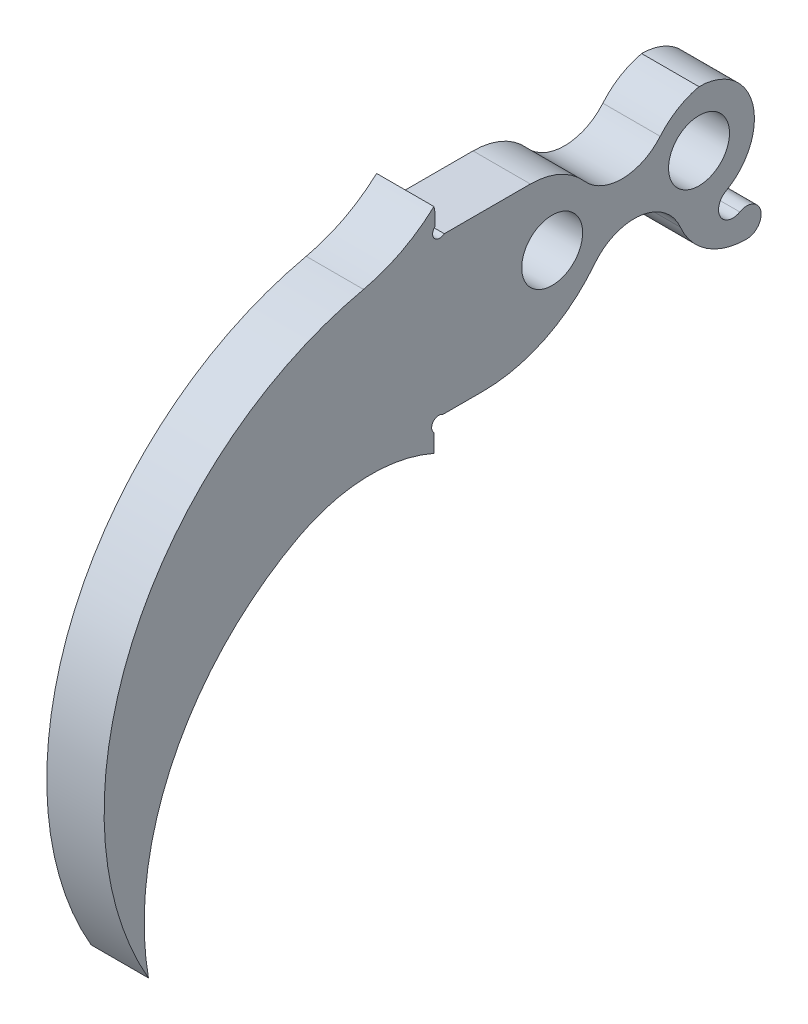
ISO-10303-21;
HEADER;
FILE_DESCRIPTION(('STEP AP214'),'2;1');
FILE_NAME('part.step','',(''),(''),'','','');
FILE_SCHEMA(('AUTOMOTIVE_DESIGN { 1 0 10303 214 1 1 1 1 }'));
ENDSEC;
DATA;
#1=APPLICATION_CONTEXT('core data for automotive mechanical design processes');
#2=APPLICATION_PROTOCOL_DEFINITION('international standard','automotive_design',2000,#1);
#3=PRODUCT_CONTEXT('',#1,'mechanical');
#4=PRODUCT('Part','Part','',(#3));
#5=PRODUCT_RELATED_PRODUCT_CATEGORY('part','',(#4));
#6=PRODUCT_DEFINITION_FORMATION('','',#4);
#7=PRODUCT_DEFINITION_CONTEXT('part definition',#1,'design');
#8=PRODUCT_DEFINITION('design','',#6,#7);
#9=PRODUCT_DEFINITION_SHAPE('','',#8);
#10=(LENGTH_UNIT() NAMED_UNIT(*) SI_UNIT(.MILLI.,.METRE.));
#11=(NAMED_UNIT(*) PLANE_ANGLE_UNIT() SI_UNIT($,.RADIAN.));
#12=(NAMED_UNIT(*) SI_UNIT($,.STERADIAN.) SOLID_ANGLE_UNIT());
#13=UNCERTAINTY_MEASURE_WITH_UNIT(LENGTH_MEASURE(1.E-05),#10,'distance_accuracy_value','');
#14=(GEOMETRIC_REPRESENTATION_CONTEXT(3) GLOBAL_UNCERTAINTY_ASSIGNED_CONTEXT((#13)) GLOBAL_UNIT_ASSIGNED_CONTEXT((#10,
#11,#12)) REPRESENTATION_CONTEXT('',''));
#15=CARTESIAN_POINT('',(0.,0.,0.));
#16=DIRECTION('',(0.,0.,1.));
#17=DIRECTION('',(1.,0.,0.));
#18=AXIS2_PLACEMENT_3D('',#15,#16,#17);
#19=CARTESIAN_POINT('',(-270.7,0.,0.));
#20=DIRECTION('',(1.,0.,0.));
#21=DIRECTION('',(0.,0.,-1.));
#22=AXIS2_PLACEMENT_3D('',#19,#20,#21);
#23=PLANE('',#22);
#24=CARTESIAN_POINT('',(-270.7,188.104455092555,538.616481200262));
#25=DIRECTION('',(1.,0.,0.));
#26=DIRECTION('',(0.,0.,-1.));
#27=AXIS2_PLACEMENT_3D('',#24,#25,#26);
#28=CIRCLE('',#27,4.24999999999999);
#29=CARTESIAN_POINT('',(-270.7,188.104455092555,534.366481200262));
#30=VERTEX_POINT('',#29);
#31=EDGE_CURVE('E344',#30,#30,#28,.F.);
#32=ORIENTED_EDGE('',*,*,#31,.T.);
#33=EDGE_LOOP('',(#32));
#34=FACE_BOUND('',#33,.T.);
#35=DIRECTION('',(0.,0.,-1.));
#36=VECTOR('',#35,1.);
#37=CARTESIAN_POINT('',(-270.7,195.836750891268,575.412895232632));
#38=LINE('',#37,#36);
#39=CARTESIAN_POINT('',(-270.7,195.836750891268,574.145756948853));
#40=VERTEX_POINT('',#39);
#41=CARTESIAN_POINT('',(-270.7,195.836750891268,562.137088492214));
#42=VERTEX_POINT('',#41);
#43=EDGE_CURVE('E193',#40,#42,#38,.T.);
#44=ORIENTED_EDGE('',*,*,#43,.F.);
#45=CARTESIAN_POINT('',(-270.7,196.610436966137,574.779326090742));
#46=DIRECTION('',(1.,0.,0.));
#47=DIRECTION('',(0.,0.,-1.));
#48=AXIS2_PLACEMENT_3D('',#45,#46,#47);
#49=CIRCLE('',#48,1.00000000000005);
#50=CARTESIAN_POINT('',(-270.7,197.384123041006,575.412895232632));
#51=VERTEX_POINT('',#50);
#52=EDGE_CURVE('E200',#40,#51,#49,.F.);
#53=ORIENTED_EDGE('',*,*,#52,.T.);
#54=DIRECTION('',(0.,-1.,0.));
#55=VECTOR('',#54,1.);
#56=CARTESIAN_POINT('',(-270.7,195.836750891268,575.412895232632));
#57=LINE('',#56,#55);
#58=CARTESIAN_POINT('',(-270.7,198.84824590337,575.412895232632));
#59=VERTEX_POINT('',#58);
#60=EDGE_CURVE('E335',#59,#51,#57,.T.);
#61=ORIENTED_EDGE('',*,*,#60,.F.);
#62=DIRECTION('',(0.,-0.984807753012209,-0.173648177666923));
#63=VECTOR('',#62,1.);
#64=CARTESIAN_POINT('',(-270.7,196.026039352418,574.915264072567));
#65=LINE('',#64,#63);
#66=CARTESIAN_POINT('',(-270.7,199.839030724963,575.587597328755));
#67=VERTEX_POINT('',#66);
#68=EDGE_CURVE('E192',#67,#59,#65,.T.);
#69=ORIENTED_EDGE('',*,*,#68,.F.);
#70=CARTESIAN_POINT('',(-270.7,215.729406191826,590.067367807445));
#71=DIRECTION('',(1.,0.,0.));
#72=DIRECTION('',(0.,0.,-1.));
#73=AXIS2_PLACEMENT_3D('',#70,#71,#72);
#74=CIRCLE('',#73,21.4980879520342);
#75=CARTESIAN_POINT('',(-270.7,194.741226884327,585.412895232632));
#76=VERTEX_POINT('',#75);
#77=EDGE_CURVE('E331',#76,#67,#74,.T.);
#78=ORIENTED_EDGE('',*,*,#77,.F.);
#79=CARTESIAN_POINT('',(-270.7,149.648729356098,575.412895232632));
#80=DIRECTION('',(1.,0.,0.));
#81=DIRECTION('',(0.,0.,-1.));
#82=AXIS2_PLACEMENT_3D('',#79,#80,#81);
#83=CIRCLE('',#82,46.18802153517);
#84=CARTESIAN_POINT('',(-270.7,126.554718588514,615.412895232632));
#85=VERTEX_POINT('',#84);
#86=EDGE_CURVE('E329',#85,#76,#83,.F.);
#87=ORIENTED_EDGE('',*,*,#86,.F.);
#88=CARTESIAN_POINT('',(-270.7,133.501294199042,575.412895232632));
#89=DIRECTION('',(1.,0.,0.));
#90=DIRECTION('',(0.,0.,-1.));
#91=AXIS2_PLACEMENT_3D('',#88,#89,#90);
#92=CIRCLE('',#91,40.5987058009585);
#93=CARTESIAN_POINT('',(-270.7,169.384333510383,594.404009009699));
#94=VERTEX_POINT('',#93);
#95=EDGE_CURVE('E327',#94,#85,#92,.T.);
#96=ORIENTED_EDGE('',*,*,#95,.F.);
#97=CARTESIAN_POINT('',(-270.7,150.383315623667,584.347712232947));
#98=DIRECTION('',(1.,0.,0.));
#99=DIRECTION('',(0.,0.,-1.));
#100=AXIS2_PLACEMENT_3D('',#97,#98,#99);
#101=CIRCLE('',#100,21.4980879520342);
#102=CARTESIAN_POINT('',(-270.7,170.026908919304,575.612895232632));
#103=VERTEX_POINT('',#102);
#104=EDGE_CURVE('E338',#103,#94,#101,.T.);
#105=ORIENTED_EDGE('',*,*,#104,.F.);
#106=DIRECTION('',(0.,-1.,0.));
#107=VECTOR('',#106,1.);
#108=CARTESIAN_POINT('',(-270.7,-103.5,575.612895232632));
#109=LINE('',#108,#107);
#110=CARTESIAN_POINT('',(-270.7,172.58052008395,575.612895232632));
#111=VERTEX_POINT('',#110);
#112=EDGE_CURVE('E199',#111,#103,#109,.T.);
#113=ORIENTED_EDGE('',*,*,#112,.F.);
#114=CARTESIAN_POINT('',(-270.7,173.290260041975,574.908431470624));
#115=DIRECTION('',(1.,0.,0.));
#116=DIRECTION('',(0.,0.,-1.));
#117=AXIS2_PLACEMENT_3D('',#114,#115,#116);
#118=CIRCLE('',#117,1.00000000000005);
#119=CARTESIAN_POINT('',(-270.7,174.1,574.321642581518));
#120=VERTEX_POINT('',#119);
#121=EDGE_CURVE('E180',#111,#120,#118,.F.);
#122=ORIENTED_EDGE('',*,*,#121,.T.);
#123=DIRECTION('',(0.,0.,1.));
#124=VECTOR('',#123,1.);
#125=CARTESIAN_POINT('',(-270.7,174.1,575.412895232632));
#126=LINE('',#125,#124);
#127=CARTESIAN_POINT('',(-270.7,174.1,568.733735067493));
#128=VERTEX_POINT('',#127);
#129=EDGE_CURVE('E186',#128,#120,#126,.T.);
#130=ORIENTED_EDGE('',*,*,#129,.F.);
#131=CARTESIAN_POINT('',(-270.7,193.802457690172,568.733735067493));
#132=DIRECTION('',(1.,0.,0.));
#133=DIRECTION('',(0.,0.,-1.));
#134=AXIS2_PLACEMENT_3D('',#131,#132,#133);
#135=CIRCLE('',#134,19.7024576901719);
#136=CARTESIAN_POINT('',(-270.7,181.708670636384,553.179727425389));
#137=VERTEX_POINT('',#136);
#138=EDGE_CURVE('E203',#128,#137,#135,.T.);
#139=ORIENTED_EDGE('',*,*,#138,.T.);
#140=CARTESIAN_POINT('',(-270.7,177.411921940979,547.653612094658));
#141=DIRECTION('',(1.,0.,0.));
#142=DIRECTION('',(0.,0.,-1.));
#143=AXIS2_PLACEMENT_3D('',#140,#141,#142);
#144=CIRCLE('',#143,7.00000000000005);
#145=CARTESIAN_POINT('',(-270.7,180.16583643587,541.21808919789));
#146=VERTEX_POINT('',#145);
#147=EDGE_CURVE('E353',#137,#146,#144,.F.);
#148=ORIENTED_EDGE('',*,*,#147,.T.);
#149=CARTESIAN_POINT('',(-270.7,184.1,532.024485059649));
#150=DIRECTION('',(1.,0.,0.));
#151=DIRECTION('',(0.,0.,-1.));
#152=AXIS2_PLACEMENT_3D('',#149,#150,#151);
#153=CIRCLE('',#152,10.);
#154=CARTESIAN_POINT('',(-270.7,174.1,532.024485059649));
#155=VERTEX_POINT('',#154);
#156=EDGE_CURVE('E210',#155,#146,#153,.F.);
#157=ORIENTED_EDGE('',*,*,#156,.F.);
#158=DIRECTION('',(0.,0.,1.));
#159=VECTOR('',#158,1.);
#160=CARTESIAN_POINT('',(-270.7,174.1,575.412895232632));
#161=LINE('',#160,#159);
#162=CARTESIAN_POINT('',(-270.7,174.1,531.947972683795));
#163=VERTEX_POINT('',#162);
#164=EDGE_CURVE('E341',#163,#155,#161,.T.);
#165=ORIENTED_EDGE('',*,*,#164,.F.);
#166=CARTESIAN_POINT('',(-270.7,176.1,531.947972683795));
#167=DIRECTION('',(1.,0.,0.));
#168=DIRECTION('',(0.,0.,-1.));
#169=AXIS2_PLACEMENT_3D('',#166,#167,#168);
#170=CIRCLE('',#169,2.);
#171=CARTESIAN_POINT('',(-270.7,177.84835370116,532.919188074756));
#172=VERTEX_POINT('',#171);
#173=EDGE_CURVE('E319',#172,#163,#170,.F.);
#174=ORIENTED_EDGE('',*,*,#173,.F.);
#175=CARTESIAN_POINT('',(-270.7,179.596707402321,533.890403465716));
#176=DIRECTION('',(1.,0.,0.));
#177=DIRECTION('',(0.,0.,-1.));
#178=AXIS2_PLACEMENT_3D('',#175,#176,#177);
#179=CIRCLE('',#178,2.00000000000003);
#180=CARTESIAN_POINT('',(-270.7,181.345061103481,534.861618856677));
#181=VERTEX_POINT('',#180);
#182=EDGE_CURVE('E321',#181,#172,#179,.T.);
#183=ORIENTED_EDGE('',*,*,#182,.F.);
#184=CARTESIAN_POINT('',(-270.7,188.104455092555,538.616481200262));
#185=DIRECTION('',(1.,0.,0.));
#186=DIRECTION('',(0.,0.,-1.));
#187=AXIS2_PLACEMENT_3D('',#184,#185,#186);
#188=CIRCLE('',#187,7.73229579871333);
#189=CARTESIAN_POINT('',(-270.7,195.836750891268,538.616481200262));
#190=VERTEX_POINT('',#189);
#191=EDGE_CURVE('E324',#190,#181,#188,.F.);
#192=ORIENTED_EDGE('',*,*,#191,.F.);
#193=CARTESIAN_POINT('',(-270.7,186.08705098848,536.393116226722));
#194=DIRECTION('',(1.,0.,0.));
#195=DIRECTION('',(0.,0.,-1.));
#196=AXIS2_PLACEMENT_3D('',#193,#194,#195);
#197=CIRCLE('',#196,10.);
#198=CARTESIAN_POINT('',(-270.7,192.544822953149,544.028375308923));
#199=VERTEX_POINT('',#198);
#200=EDGE_CURVE('E314',#199,#190,#197,.F.);
#201=ORIENTED_EDGE('',*,*,#200,.F.);
#202=CARTESIAN_POINT('',(-270.7,197.065263328418,549.373056666464));
#203=DIRECTION('',(1.,0.,0.));
#204=DIRECTION('',(0.,0.,-1.));
#205=AXIS2_PLACEMENT_3D('',#202,#203,#204);
#206=CIRCLE('',#205,7.00000000000004);
#207=CARTESIAN_POINT('',(-270.7,192.441758207239,554.628834477067));
#208=VERTEX_POINT('',#207);
#209=EDGE_CURVE('E350',#199,#208,#206,.F.);
#210=ORIENTED_EDGE('',*,*,#209,.T.);
#211=CARTESIAN_POINT('',(-270.7,185.836750891268,562.137088492214));
#212=DIRECTION('',(1.,0.,0.));
#213=DIRECTION('',(0.,0.,-1.));
#214=AXIS2_PLACEMENT_3D('',#211,#212,#213);
#215=CIRCLE('',#214,10.);
#216=EDGE_CURVE('E316',#42,#208,#215,.F.);
#217=ORIENTED_EDGE('',*,*,#216,.F.);
#218=EDGE_LOOP('',(#44,#53,#61,#69,#78,#87,#96,#105,#113,#122,#130,#139,#148,#157,#165,#174,
#183,#192,#201,#210,#217));
#219=FACE_BOUND('',#218,.T.);
#220=CARTESIAN_POINT('',(-270.7,186.312329952889,559.100565279743));
#221=DIRECTION('',(1.,0.,0.));
#222=DIRECTION('',(0.,0.,-1.));
#223=AXIS2_PLACEMENT_3D('',#220,#221,#222);
#224=CIRCLE('',#223,4.25000000000001);
#225=CARTESIAN_POINT('',(-270.7,186.312329952889,554.850565279743));
#226=VERTEX_POINT('',#225);
#227=EDGE_CURVE('E347',#226,#226,#224,.F.);
#228=ORIENTED_EDGE('',*,*,#227,.T.);
#229=EDGE_LOOP('',(#228));
#230=FACE_BOUND('',#229,.T.);
#231=ADVANCED_FACE('F37',(#34,#219,#230),#23,.T.);
#232=CARTESIAN_POINT('',(-262.7,196.026039352418,574.915264072567));
#233=DIRECTION('',(0.,0.173648177666923,-0.984807753012209));
#234=DIRECTION('',(0.,0.984807753012209,0.173648177666923));
#235=AXIS2_PLACEMENT_3D('',#232,#233,#234);
#236=PLANE('',#235);
#237=DIRECTION('',(-1.,0.,0.));
#238=VECTOR('',#237,1.);
#239=CARTESIAN_POINT('',(-243.132171481362,199.839030724963,575.587597328755));
#240=LINE('',#239,#238);
#241=CARTESIAN_POINT('',(-278.7,199.839030724963,575.587597328755));
#242=VERTEX_POINT('',#241);
#243=EDGE_CURVE('E244',#67,#242,#240,.T.);
#244=ORIENTED_EDGE('',*,*,#243,.F.);
#245=ORIENTED_EDGE('',*,*,#68,.T.);
#246=DIRECTION('',(1.,0.,0.));
#247=VECTOR('',#246,1.);
#248=CARTESIAN_POINT('',(-243.132171481362,198.84824590337,575.412895232632));
#249=LINE('',#248,#247);
#250=CARTESIAN_POINT('',(-278.7,198.84824590337,575.412895232632));
#251=VERTEX_POINT('',#250);
#252=EDGE_CURVE('E222',#251,#59,#249,.T.);
#253=ORIENTED_EDGE('',*,*,#252,.F.);
#254=DIRECTION('',(0.,-0.984807753012209,-0.173648177666923));
#255=VECTOR('',#254,1.);
#256=CARTESIAN_POINT('',(-278.7,196.026039352418,574.915264072567));
#257=LINE('',#256,#255);
#258=EDGE_CURVE('E292',#242,#251,#257,.T.);
#259=ORIENTED_EDGE('',*,*,#258,.F.);
#260=EDGE_LOOP('',(#244,#245,#253,#259));
#261=FACE_BOUND('',#260,.T.);
#262=ADVANCED_FACE('F407',(#261),#236,.T.);
#263=CARTESIAN_POINT('',(-243.132171481362,215.729406191826,590.067367807445));
#264=DIRECTION('',(-1.,0.,0.));
#265=DIRECTION('',(0.,0.,1.));
#266=AXIS2_PLACEMENT_3D('',#263,#264,#265);
#267=CYLINDRICAL_SURFACE('',#266,21.4980879520342);
#268=DIRECTION('',(-1.,0.,0.));
#269=VECTOR('',#268,1.);
#270=CARTESIAN_POINT('',(-243.132171481362,194.741226884327,585.412895232632));
#271=LINE('',#270,#269);
#272=CARTESIAN_POINT('',(-278.7,194.741226884327,585.412895232632));
#273=VERTEX_POINT('',#272);
#274=EDGE_CURVE('E240',#76,#273,#271,.T.);
#275=ORIENTED_EDGE('',*,*,#274,.F.);
#276=ORIENTED_EDGE('',*,*,#77,.T.);
#277=ORIENTED_EDGE('',*,*,#243,.T.);
#278=CARTESIAN_POINT('',(-278.7,215.729406191826,590.067367807445));
#279=DIRECTION('',(1.,0.,0.));
#280=DIRECTION('',(0.,0.,-1.));
#281=AXIS2_PLACEMENT_3D('',#278,#279,#280);
#282=CIRCLE('',#281,21.4980879520342);
#283=EDGE_CURVE('E294',#273,#242,#282,.T.);
#284=ORIENTED_EDGE('',*,*,#283,.F.);
#285=EDGE_LOOP('',(#275,#276,#277,#284));
#286=FACE_BOUND('',#285,.T.);
#287=ADVANCED_FACE('F411',(#286),#267,.F.);
#288=CARTESIAN_POINT('',(-279.7,149.648729356098,575.412895232632));
#289=DIRECTION('',(1.,0.,0.));
#290=DIRECTION('',(0.,0.,-1.));
#291=AXIS2_PLACEMENT_3D('',#288,#289,#290);
#292=CYLINDRICAL_SURFACE('',#291,46.18802153517);
#293=DIRECTION('',(1.,0.,0.));
#294=VECTOR('',#293,1.);
#295=CARTESIAN_POINT('',(-279.7,126.554718588514,615.412895232632));
#296=LINE('',#295,#294);
#297=CARTESIAN_POINT('',(-278.7,126.554718588514,615.412895232632));
#298=VERTEX_POINT('',#297);
#299=EDGE_CURVE('E225',#298,#85,#296,.T.);
#300=ORIENTED_EDGE('',*,*,#299,.T.);
#301=ORIENTED_EDGE('',*,*,#86,.T.);
#302=ORIENTED_EDGE('',*,*,#274,.T.);
#303=CARTESIAN_POINT('',(-278.7,149.648729356098,575.412895232632));
#304=DIRECTION('',(1.,0.,0.));
#305=DIRECTION('',(0.,0.,-1.));
#306=AXIS2_PLACEMENT_3D('',#303,#304,#305);
#307=CIRCLE('',#306,46.18802153517);
#308=EDGE_CURVE('E297',#298,#273,#307,.F.);
#309=ORIENTED_EDGE('',*,*,#308,.F.);
#310=EDGE_LOOP('',(#300,#301,#302,#309));
#311=FACE_BOUND('',#310,.T.);
#312=ADVANCED_FACE('F416',(#311),#292,.T.);
#313=CARTESIAN_POINT('',(-243.132171481362,150.383315623667,584.347712232947));
#314=DIRECTION('',(-1.,0.,0.));
#315=DIRECTION('',(0.,0.,1.));
#316=AXIS2_PLACEMENT_3D('',#313,#314,#315);
#317=CYLINDRICAL_SURFACE('',#316,21.4980879520342);
#318=DIRECTION('',(-1.,0.,0.));
#319=VECTOR('',#318,1.);
#320=CARTESIAN_POINT('',(-243.132171481362,170.026908919304,575.612895232632));
#321=LINE('',#320,#319);
#322=CARTESIAN_POINT('',(-278.7,170.026908919304,575.612895232632));
#323=VERTEX_POINT('',#322);
#324=EDGE_CURVE('E246',#323,#103,#321,.F.);
#325=ORIENTED_EDGE('',*,*,#324,.T.);
#326=ORIENTED_EDGE('',*,*,#104,.T.);
#327=DIRECTION('',(-1.,0.,0.));
#328=VECTOR('',#327,1.);
#329=CARTESIAN_POINT('',(-243.132171481362,169.384333510383,594.404009009699));
#330=LINE('',#329,#328);
#331=CARTESIAN_POINT('',(-278.7,169.384333510383,594.404009009699));
#332=VERTEX_POINT('',#331);
#333=EDGE_CURVE('E242',#94,#332,#330,.T.);
#334=ORIENTED_EDGE('',*,*,#333,.T.);
#335=CARTESIAN_POINT('',(-278.7,150.383315623667,584.347712232947));
#336=DIRECTION('',(1.,0.,0.));
#337=DIRECTION('',(0.,0.,-1.));
#338=AXIS2_PLACEMENT_3D('',#335,#336,#337);
#339=CIRCLE('',#338,21.4980879520342);
#340=EDGE_CURVE('E302',#323,#332,#339,.T.);
#341=ORIENTED_EDGE('',*,*,#340,.F.);
#342=EDGE_LOOP('',(#325,#326,#334,#341));
#343=FACE_BOUND('',#342,.T.);
#344=ADVANCED_FACE('F421',(#343),#317,.F.);
#345=CARTESIAN_POINT('',(-243.132171481362,195.836750891268,575.412895232632));
#346=DIRECTION('',(0.,0.,-1.));
#347=DIRECTION('',(-1.,0.,0.));
#348=AXIS2_PLACEMENT_3D('',#345,#346,#347);
#349=PLANE('',#348);
#350=ORIENTED_EDGE('',*,*,#252,.T.);
#351=ORIENTED_EDGE('',*,*,#60,.T.);
#352=DIRECTION('',(-1.,0.,0.));
#353=VECTOR('',#352,1.);
#354=CARTESIAN_POINT('',(-262.7,197.384123041006,575.412895232632));
#355=LINE('',#354,#353);
#356=CARTESIAN_POINT('',(-278.7,197.384123041006,575.412895232632));
#357=VERTEX_POINT('',#356);
#358=EDGE_CURVE('E255',#357,#51,#355,.F.);
#359=ORIENTED_EDGE('',*,*,#358,.F.);
#360=DIRECTION('',(0.,-1.,0.));
#361=VECTOR('',#360,1.);
#362=CARTESIAN_POINT('',(-278.7,195.836750891268,575.412895232632));
#363=LINE('',#362,#361);
#364=EDGE_CURVE('E271',#251,#357,#363,.T.);
#365=ORIENTED_EDGE('',*,*,#364,.F.);
#366=EDGE_LOOP('',(#350,#351,#359,#365));
#367=FACE_BOUND('',#366,.T.);
#368=ADVANCED_FACE('F404',(#367),#349,.T.);
#369=CARTESIAN_POINT('',(-279.7,174.1,575.412895232632));
#370=DIRECTION('',(0.,-1.,0.));
#371=DIRECTION('',(0.,0.,-1.));
#372=AXIS2_PLACEMENT_3D('',#369,#370,#371);
#373=PLANE('',#372);
#374=DIRECTION('',(-1.,0.,0.));
#375=VECTOR('',#374,1.);
#376=CARTESIAN_POINT('',(-262.7,174.1,568.733735067493));
#377=LINE('',#376,#375);
#378=CARTESIAN_POINT('',(-278.7,174.1,568.733735067493));
#379=VERTEX_POINT('',#378);
#380=EDGE_CURVE('E188',#128,#379,#377,.T.);
#381=ORIENTED_EDGE('',*,*,#380,.F.);
#382=ORIENTED_EDGE('',*,*,#129,.T.);
#383=DIRECTION('',(-1.,0.,0.));
#384=VECTOR('',#383,1.);
#385=CARTESIAN_POINT('',(-262.7,174.1,574.321642581518));
#386=LINE('',#385,#384);
#387=CARTESIAN_POINT('',(-278.7,174.1,574.321642581518));
#388=VERTEX_POINT('',#387);
#389=EDGE_CURVE('E45',#388,#120,#386,.F.);
#390=ORIENTED_EDGE('',*,*,#389,.F.);
#391=DIRECTION('',(0.,0.,1.));
#392=VECTOR('',#391,1.);
#393=CARTESIAN_POINT('',(-278.7,174.1,575.412895232632));
#394=LINE('',#393,#392);
#395=EDGE_CURVE('E291',#379,#388,#394,.T.);
#396=ORIENTED_EDGE('',*,*,#395,.F.);
#397=EDGE_LOOP('',(#381,#382,#390,#396));
#398=FACE_BOUND('',#397,.T.);
#399=ADVANCED_FACE('F187',(#398),#373,.T.);
#400=CARTESIAN_POINT('',(-278.7,133.501294199042,575.412895232632));
#401=DIRECTION('',(1.,0.,0.));
#402=DIRECTION('',(0.,0.,-1.));
#403=AXIS2_PLACEMENT_3D('',#400,#401,#402);
#404=PLANE('',#403);
#405=CARTESIAN_POINT('',(-278.7,186.312329952889,559.100565279743));
#406=DIRECTION('',(1.,0.,0.));
#407=DIRECTION('',(0.,0.,-1.));
#408=AXIS2_PLACEMENT_3D('',#405,#406,#407);
#409=CIRCLE('',#408,4.25000000000001);
#410=CARTESIAN_POINT('',(-278.7,186.312329952889,554.850565279743));
#411=VERTEX_POINT('',#410);
#412=EDGE_CURVE('E276',#411,#411,#409,.F.);
#413=ORIENTED_EDGE('',*,*,#412,.F.);
#414=EDGE_LOOP('',(#413));
#415=FACE_BOUND('',#414,.T.);
#416=DIRECTION('',(0.,0.,-1.));
#417=VECTOR('',#416,1.);
#418=CARTESIAN_POINT('',(-278.7,195.836750891268,575.412895232632));
#419=LINE('',#418,#417);
#420=CARTESIAN_POINT('',(-278.7,195.836750891268,574.145756948853));
#421=VERTEX_POINT('',#420);
#422=CARTESIAN_POINT('',(-278.7,195.836750891268,562.137088492214));
#423=VERTEX_POINT('',#422);
#424=EDGE_CURVE('E268',#421,#423,#419,.T.);
#425=ORIENTED_EDGE('',*,*,#424,.T.);
#426=CARTESIAN_POINT('',(-278.7,185.836750891268,562.137088492214));
#427=DIRECTION('',(1.,0.,0.));
#428=DIRECTION('',(0.,0.,-1.));
#429=AXIS2_PLACEMENT_3D('',#426,#427,#428);
#430=CIRCLE('',#429,10.);
#431=CARTESIAN_POINT('',(-278.7,192.441758207239,554.628834477067));
#432=VERTEX_POINT('',#431);
#433=EDGE_CURVE('E213',#423,#432,#430,.F.);
#434=ORIENTED_EDGE('',*,*,#433,.T.);
#435=CARTESIAN_POINT('',(-278.7,197.065263328418,549.373056666464));
#436=DIRECTION('',(-1.,0.,0.));
#437=DIRECTION('',(0.,0.,1.));
#438=AXIS2_PLACEMENT_3D('',#435,#436,#437);
#439=CIRCLE('',#438,7.00000000000004);
#440=CARTESIAN_POINT('',(-278.7,192.544822953149,544.028375308923));
#441=VERTEX_POINT('',#440);
#442=EDGE_CURVE('E252',#441,#432,#439,.T.);
#443=ORIENTED_EDGE('',*,*,#442,.F.);
#444=CARTESIAN_POINT('',(-278.7,186.08705098848,536.393116226722));
#445=DIRECTION('',(1.,0.,0.));
#446=DIRECTION('',(0.,0.,-1.));
#447=AXIS2_PLACEMENT_3D('',#444,#445,#446);
#448=CIRCLE('',#447,10.);
#449=CARTESIAN_POINT('',(-278.7,195.836750891268,538.616481200262));
#450=VERTEX_POINT('',#449);
#451=EDGE_CURVE('E393',#441,#450,#448,.F.);
#452=ORIENTED_EDGE('',*,*,#451,.T.);
#453=CARTESIAN_POINT('',(-278.7,188.104455092555,538.616481200262));
#454=DIRECTION('',(1.,0.,0.));
#455=DIRECTION('',(0.,0.,-1.));
#456=AXIS2_PLACEMENT_3D('',#453,#454,#455);
#457=CIRCLE('',#456,7.73229579871333);
#458=CARTESIAN_POINT('',(-278.7,181.345061103481,534.861618856677));
#459=VERTEX_POINT('',#458);
#460=EDGE_CURVE('E275',#450,#459,#457,.F.);
#461=ORIENTED_EDGE('',*,*,#460,.T.);
#462=CARTESIAN_POINT('',(-278.7,179.596707402321,533.890403465716));
#463=DIRECTION('',(1.,0.,0.));
#464=DIRECTION('',(0.,0.,-1.));
#465=AXIS2_PLACEMENT_3D('',#462,#463,#464);
#466=CIRCLE('',#465,2.00000000000003);
#467=CARTESIAN_POINT('',(-278.7,177.84835370116,532.919188074756));
#468=VERTEX_POINT('',#467);
#469=EDGE_CURVE('E278',#459,#468,#466,.T.);
#470=ORIENTED_EDGE('',*,*,#469,.T.);
#471=CARTESIAN_POINT('',(-278.7,176.1,531.947972683795));
#472=DIRECTION('',(1.,0.,0.));
#473=DIRECTION('',(0.,0.,-1.));
#474=AXIS2_PLACEMENT_3D('',#471,#472,#473);
#475=CIRCLE('',#474,2.);
#476=CARTESIAN_POINT('',(-278.7,174.1,531.947972683795));
#477=VERTEX_POINT('',#476);
#478=EDGE_CURVE('E285',#468,#477,#475,.F.);
#479=ORIENTED_EDGE('',*,*,#478,.T.);
#480=CARTESIAN_POINT('',(-278.7,174.1,532.024485059649));
#481=VERTEX_POINT('',#480);
#482=EDGE_CURVE('E288',#477,#481,#394,.T.);
#483=ORIENTED_EDGE('',*,*,#482,.T.);
#484=CARTESIAN_POINT('',(-278.7,184.1,532.024485059649));
#485=DIRECTION('',(1.,0.,0.));
#486=DIRECTION('',(0.,0.,-1.));
#487=AXIS2_PLACEMENT_3D('',#484,#485,#486);
#488=CIRCLE('',#487,10.);
#489=CARTESIAN_POINT('',(-278.7,180.16583643587,541.21808919789));
#490=VERTEX_POINT('',#489);
#491=EDGE_CURVE('E217',#481,#490,#488,.F.);
#492=ORIENTED_EDGE('',*,*,#491,.T.);
#493=CARTESIAN_POINT('',(-278.7,177.411921940979,547.653612094658));
#494=DIRECTION('',(-1.,0.,0.));
#495=DIRECTION('',(0.,0.,1.));
#496=AXIS2_PLACEMENT_3D('',#493,#494,#495);
#497=CIRCLE('',#496,7.00000000000005);
#498=CARTESIAN_POINT('',(-278.7,181.708670636384,553.179727425389));
#499=VERTEX_POINT('',#498);
#500=EDGE_CURVE('E257',#499,#490,#497,.T.);
#501=ORIENTED_EDGE('',*,*,#500,.F.);
#502=CARTESIAN_POINT('',(-278.7,193.802457690172,568.733735067493));
#503=DIRECTION('',(1.,0.,0.));
#504=DIRECTION('',(0.,0.,1.));
#505=AXIS2_PLACEMENT_3D('',#502,#503,#504);
#506=CIRCLE('',#505,19.7024576901719);
#507=EDGE_CURVE('E254',#379,#499,#506,.T.);
#508=ORIENTED_EDGE('',*,*,#507,.F.);
#509=ORIENTED_EDGE('',*,*,#395,.T.);
#510=CARTESIAN_POINT('',(-278.7,173.290260041975,574.908431470624));
#511=DIRECTION('',(1.,0.,0.));
#512=DIRECTION('',(0.,0.,-1.));
#513=AXIS2_PLACEMENT_3D('',#510,#511,#512);
#514=CIRCLE('',#513,1.00000000000005);
#515=CARTESIAN_POINT('',(-278.7,172.58052008395,575.612895232632));
#516=VERTEX_POINT('',#515);
#517=EDGE_CURVE('E51',#388,#516,#514,.T.);
#518=ORIENTED_EDGE('',*,*,#517,.T.);
#519=DIRECTION('',(0.,-1.,0.));
#520=VECTOR('',#519,1.);
#521=CARTESIAN_POINT('',(-278.7,-103.5,575.612895232632));
#522=LINE('',#521,#520);
#523=EDGE_CURVE('E305',#516,#323,#522,.T.);
#524=ORIENTED_EDGE('',*,*,#523,.T.);
#525=ORIENTED_EDGE('',*,*,#340,.T.);
#526=CARTESIAN_POINT('',(-278.7,133.501294199042,575.412895232632));
#527=DIRECTION('',(1.,0.,0.));
#528=DIRECTION('',(0.,0.,-1.));
#529=AXIS2_PLACEMENT_3D('',#526,#527,#528);
#530=CIRCLE('',#529,40.5987058009585);
#531=EDGE_CURVE('E300',#332,#298,#530,.T.);
#532=ORIENTED_EDGE('',*,*,#531,.T.);
#533=ORIENTED_EDGE('',*,*,#308,.T.);
#534=ORIENTED_EDGE('',*,*,#283,.T.);
#535=ORIENTED_EDGE('',*,*,#258,.T.);
#536=ORIENTED_EDGE('',*,*,#364,.T.);
#537=CARTESIAN_POINT('',(-278.7,196.610436966137,574.779326090742));
#538=DIRECTION('',(1.,0.,0.));
#539=DIRECTION('',(0.,0.,-1.));
#540=AXIS2_PLACEMENT_3D('',#537,#538,#539);
#541=CIRCLE('',#540,1.00000000000005);
#542=EDGE_CURVE('E59',#357,#421,#541,.T.);
#543=ORIENTED_EDGE('',*,*,#542,.T.);
#544=EDGE_LOOP('',(#425,#434,#443,#452,#461,#470,#479,#483,#492,#501,#508,#509,#518,#524,#525,
#532,#533,#534,#535,#536,#543));
#545=FACE_BOUND('',#544,.T.);
#546=CARTESIAN_POINT('',(-278.7,188.104455092555,538.616481200262));
#547=DIRECTION('',(1.,0.,0.));
#548=DIRECTION('',(0.,0.,-1.));
#549=AXIS2_PLACEMENT_3D('',#546,#547,#548);
#550=CIRCLE('',#549,4.24999999999999);
#551=CARTESIAN_POINT('',(-278.7,188.104455092555,534.366481200262));
#552=VERTEX_POINT('',#551);
#553=EDGE_CURVE('E249',#552,#552,#550,.F.);
#554=ORIENTED_EDGE('',*,*,#553,.F.);
#555=EDGE_LOOP('',(#554));
#556=FACE_BOUND('',#555,.T.);
#557=ADVANCED_FACE('F266',(#415,#545,#556),#404,.F.);
#558=CARTESIAN_POINT('',(-262.7,177.411921940979,547.653612094658));
#559=DIRECTION('',(-1.,0.,0.));
#560=DIRECTION('',(0.,0.,1.));
#561=AXIS2_PLACEMENT_3D('',#558,#559,#560);
#562=CYLINDRICAL_SURFACE('',#561,7.00000000000005);
#563=ORIENTED_EDGE('',*,*,#147,.F.);
#564=DIRECTION('',(-1.,0.,0.));
#565=VECTOR('',#564,1.);
#566=CARTESIAN_POINT('',(-262.7,181.708670636384,553.179727425389));
#567=LINE('',#566,#565);
#568=EDGE_CURVE('E250',#137,#499,#567,.T.);
#569=ORIENTED_EDGE('',*,*,#568,.T.);
#570=ORIENTED_EDGE('',*,*,#500,.T.);
#571=DIRECTION('',(-1.,0.,0.));
#572=VECTOR('',#571,1.);
#573=CARTESIAN_POINT('',(-262.7,180.16583643587,541.21808919789));
#574=LINE('',#573,#572);
#575=EDGE_CURVE('E209',#490,#146,#574,.F.);
#576=ORIENTED_EDGE('',*,*,#575,.T.);
#577=EDGE_LOOP('',(#563,#569,#570,#576));
#578=FACE_BOUND('',#577,.T.);
#579=ADVANCED_FACE('F361',(#578),#562,.F.);
#580=DIRECTION('',(1.,0.,0.));
#581=VECTOR('',#580,1.);
#582=CARTESIAN_POINT('',(-279.7,174.1,531.947972683795));
#583=LINE('',#582,#581);
#584=EDGE_CURVE('E237',#477,#163,#583,.T.);
#585=ORIENTED_EDGE('',*,*,#584,.T.);
#586=ORIENTED_EDGE('',*,*,#164,.T.);
#587=DIRECTION('',(1.,0.,0.));
#588=VECTOR('',#587,1.);
#589=CARTESIAN_POINT('',(-278.7,174.1,532.024485059649));
#590=LINE('',#589,#588);
#591=EDGE_CURVE('E207',#155,#481,#590,.F.);
#592=ORIENTED_EDGE('',*,*,#591,.T.);
#593=ORIENTED_EDGE('',*,*,#482,.F.);
#594=EDGE_LOOP('',(#585,#586,#592,#593));
#595=FACE_BOUND('',#594,.T.);
#596=ADVANCED_FACE('F369',(#595),#373,.T.);
#597=CARTESIAN_POINT('',(-262.7,184.1,532.024485059649));
#598=DIRECTION('',(-1.,0.,0.));
#599=DIRECTION('',(0.,0.,1.));
#600=AXIS2_PLACEMENT_3D('',#597,#598,#599);
#601=CYLINDRICAL_SURFACE('',#600,10.);
#602=ORIENTED_EDGE('',*,*,#591,.F.);
#603=ORIENTED_EDGE('',*,*,#156,.T.);
#604=ORIENTED_EDGE('',*,*,#575,.F.);
#605=ORIENTED_EDGE('',*,*,#491,.F.);
#606=EDGE_LOOP('',(#602,#603,#604,#605));
#607=FACE_BOUND('',#606,.T.);
#608=ADVANCED_FACE('F366',(#607),#601,.T.);
#609=CARTESIAN_POINT('',(-279.7,188.104455092555,538.616481200262));
#610=DIRECTION('',(1.,0.,0.));
#611=DIRECTION('',(0.,0.,-1.));
#612=AXIS2_PLACEMENT_3D('',#609,#610,#611);
#613=CYLINDRICAL_SURFACE('',#612,7.73229579871333);
#614=DIRECTION('',(1.,0.,0.));
#615=VECTOR('',#614,1.);
#616=CARTESIAN_POINT('',(-279.7,195.836750891268,538.616481200262));
#617=LINE('',#616,#615);
#618=EDGE_CURVE('E228',#450,#190,#617,.T.);
#619=ORIENTED_EDGE('',*,*,#618,.T.);
#620=ORIENTED_EDGE('',*,*,#191,.T.);
#621=DIRECTION('',(1.,0.,0.));
#622=VECTOR('',#621,1.);
#623=CARTESIAN_POINT('',(-279.7,181.345061103481,534.861618856677));
#624=LINE('',#623,#622);
#625=EDGE_CURVE('E231',#459,#181,#624,.T.);
#626=ORIENTED_EDGE('',*,*,#625,.F.);
#627=ORIENTED_EDGE('',*,*,#460,.F.);
#628=EDGE_LOOP('',(#619,#620,#626,#627));
#629=FACE_BOUND('',#628,.T.);
#630=ADVANCED_FACE('F383',(#629),#613,.T.);
#631=CARTESIAN_POINT('',(-262.7,197.065263328418,549.373056666464));
#632=DIRECTION('',(-1.,0.,0.));
#633=DIRECTION('',(0.,0.,1.));
#634=AXIS2_PLACEMENT_3D('',#631,#632,#633);
#635=CYLINDRICAL_SURFACE('',#634,7.00000000000004);
#636=ORIENTED_EDGE('',*,*,#209,.F.);
#637=DIRECTION('',(-1.,0.,0.));
#638=VECTOR('',#637,1.);
#639=CARTESIAN_POINT('',(-262.7,192.544822953149,544.028375308923));
#640=LINE('',#639,#638);
#641=EDGE_CURVE('E220',#199,#441,#640,.T.);
#642=ORIENTED_EDGE('',*,*,#641,.T.);
#643=ORIENTED_EDGE('',*,*,#442,.T.);
#644=DIRECTION('',(-1.,0.,0.));
#645=VECTOR('',#644,1.);
#646=CARTESIAN_POINT('',(-262.7,192.441758207239,554.628834477067));
#647=LINE('',#646,#645);
#648=EDGE_CURVE('E216',#432,#208,#647,.F.);
#649=ORIENTED_EDGE('',*,*,#648,.T.);
#650=EDGE_LOOP('',(#636,#642,#643,#649));
#651=FACE_BOUND('',#650,.T.);
#652=ADVANCED_FACE('F389',(#651),#635,.F.);
#653=CARTESIAN_POINT('',(-279.7,186.08705098848,536.393116226722));
#654=DIRECTION('',(-1.,0.,0.));
#655=DIRECTION('',(0.,0.,1.));
#656=AXIS2_PLACEMENT_3D('',#653,#654,#655);
#657=CYLINDRICAL_SURFACE('',#656,10.);
#658=ORIENTED_EDGE('',*,*,#641,.F.);
#659=ORIENTED_EDGE('',*,*,#200,.T.);
#660=ORIENTED_EDGE('',*,*,#618,.F.);
#661=ORIENTED_EDGE('',*,*,#451,.F.);
#662=EDGE_LOOP('',(#658,#659,#660,#661));
#663=FACE_BOUND('',#662,.T.);
#664=ADVANCED_FACE('F392',(#663),#657,.T.);
#665=CARTESIAN_POINT('',(-279.7,195.836750891268,575.412895232632));
#666=DIRECTION('',(0.,1.,0.));
#667=DIRECTION('',(0.,0.,1.));
#668=AXIS2_PLACEMENT_3D('',#665,#666,#667);
#669=PLANE('',#668);
#670=DIRECTION('',(-1.,0.,0.));
#671=VECTOR('',#670,1.);
#672=CARTESIAN_POINT('',(-262.7,195.836750891268,574.145756948853));
#673=LINE('',#672,#671);
#674=EDGE_CURVE('E184',#40,#421,#673,.T.);
#675=ORIENTED_EDGE('',*,*,#674,.F.);
#676=ORIENTED_EDGE('',*,*,#43,.T.);
#677=DIRECTION('',(1.,0.,0.));
#678=VECTOR('',#677,1.);
#679=CARTESIAN_POINT('',(-278.7,195.836750891268,562.137088492214));
#680=LINE('',#679,#678);
#681=EDGE_CURVE('E214',#42,#423,#680,.F.);
#682=ORIENTED_EDGE('',*,*,#681,.T.);
#683=ORIENTED_EDGE('',*,*,#424,.F.);
#684=EDGE_LOOP('',(#675,#676,#682,#683));
#685=FACE_BOUND('',#684,.T.);
#686=ADVANCED_FACE('F273',(#685),#669,.T.);
#687=CARTESIAN_POINT('',(-262.7,185.836750891268,562.137088492214));
#688=DIRECTION('',(-1.,0.,0.));
#689=DIRECTION('',(0.,0.,1.));
#690=AXIS2_PLACEMENT_3D('',#687,#688,#689);
#691=CYLINDRICAL_SURFACE('',#690,10.);
#692=ORIENTED_EDGE('',*,*,#681,.F.);
#693=ORIENTED_EDGE('',*,*,#216,.T.);
#694=ORIENTED_EDGE('',*,*,#648,.F.);
#695=ORIENTED_EDGE('',*,*,#433,.F.);
#696=EDGE_LOOP('',(#692,#693,#694,#695));
#697=FACE_BOUND('',#696,.T.);
#698=ADVANCED_FACE('F397',(#697),#691,.T.);
#699=CARTESIAN_POINT('',(-262.7,-103.5,575.612895232632));
#700=DIRECTION('',(0.,0.,-1.));
#701=DIRECTION('',(-1.,0.,0.));
#702=AXIS2_PLACEMENT_3D('',#699,#700,#701);
#703=PLANE('',#702);
#704=DIRECTION('',(-1.,0.,0.));
#705=VECTOR('',#704,1.);
#706=CARTESIAN_POINT('',(-262.7,172.58052008395,575.612895232632));
#707=LINE('',#706,#705);
#708=EDGE_CURVE('E11',#111,#516,#707,.T.);
#709=ORIENTED_EDGE('',*,*,#708,.F.);
#710=ORIENTED_EDGE('',*,*,#112,.T.);
#711=ORIENTED_EDGE('',*,*,#324,.F.);
#712=ORIENTED_EDGE('',*,*,#523,.F.);
#713=EDGE_LOOP('',(#709,#710,#711,#712));
#714=FACE_BOUND('',#713,.T.);
#715=ADVANCED_FACE('F426',(#714),#703,.T.);
#716=CARTESIAN_POINT('',(-262.7,173.290260041975,574.908431470624));
#717=DIRECTION('',(-1.,0.,0.));
#718=DIRECTION('',(0.,0.,1.));
#719=AXIS2_PLACEMENT_3D('',#716,#717,#718);
#720=CYLINDRICAL_SURFACE('',#719,1.00000000000005);
#721=ORIENTED_EDGE('',*,*,#121,.F.);
#722=ORIENTED_EDGE('',*,*,#708,.T.);
#723=ORIENTED_EDGE('',*,*,#517,.F.);
#724=ORIENTED_EDGE('',*,*,#389,.T.);
#725=EDGE_LOOP('',(#721,#722,#723,#724));
#726=FACE_BOUND('',#725,.T.);
#727=ADVANCED_FACE('F178',(#726),#720,.F.);
#728=CARTESIAN_POINT('',(-262.7,196.610436966137,574.779326090742));
#729=DIRECTION('',(-1.,0.,0.));
#730=DIRECTION('',(0.,0.,1.));
#731=AXIS2_PLACEMENT_3D('',#728,#729,#730);
#732=CYLINDRICAL_SURFACE('',#731,1.00000000000005);
#733=ORIENTED_EDGE('',*,*,#52,.F.);
#734=ORIENTED_EDGE('',*,*,#674,.T.);
#735=ORIENTED_EDGE('',*,*,#542,.F.);
#736=ORIENTED_EDGE('',*,*,#358,.T.);
#737=EDGE_LOOP('',(#733,#734,#735,#736));
#738=FACE_BOUND('',#737,.T.);
#739=ADVANCED_FACE('F259',(#738),#732,.F.);
#740=CARTESIAN_POINT('',(-262.7,193.802457690172,568.733735067493));
#741=DIRECTION('',(-1.,0.,0.));
#742=DIRECTION('',(0.,0.,1.));
#743=AXIS2_PLACEMENT_3D('',#740,#741,#742);
#744=CYLINDRICAL_SURFACE('',#743,19.7024576901719);
#745=ORIENTED_EDGE('',*,*,#138,.F.);
#746=ORIENTED_EDGE('',*,*,#380,.T.);
#747=ORIENTED_EDGE('',*,*,#507,.T.);
#748=ORIENTED_EDGE('',*,*,#568,.F.);
#749=EDGE_LOOP('',(#745,#746,#747,#748));
#750=FACE_BOUND('',#749,.T.);
#751=ADVANCED_FACE('F357',(#750),#744,.T.);
#752=CARTESIAN_POINT('',(-279.7,186.312329952889,559.100565279743));
#753=DIRECTION('',(1.,0.,0.));
#754=DIRECTION('',(0.,0.,-1.));
#755=AXIS2_PLACEMENT_3D('',#752,#753,#754);
#756=CYLINDRICAL_SURFACE('',#755,4.25000000000001);
#757=ORIENTED_EDGE('',*,*,#412,.T.);
#758=EDGE_LOOP('',(#757));
#759=FACE_BOUND('',#758,.T.);
#760=ORIENTED_EDGE('',*,*,#227,.F.);
#761=EDGE_LOOP('',(#760));
#762=FACE_BOUND('',#761,.T.);
#763=ADVANCED_FACE('F481',(#759,#762),#756,.F.);
#764=CARTESIAN_POINT('',(-279.7,188.104455092555,538.616481200262));
#765=DIRECTION('',(1.,0.,0.));
#766=DIRECTION('',(0.,0.,-1.));
#767=AXIS2_PLACEMENT_3D('',#764,#765,#766);
#768=CYLINDRICAL_SURFACE('',#767,4.24999999999999);
#769=ORIENTED_EDGE('',*,*,#553,.T.);
#770=EDGE_LOOP('',(#769));
#771=FACE_BOUND('',#770,.T.);
#772=ORIENTED_EDGE('',*,*,#31,.F.);
#773=EDGE_LOOP('',(#772));
#774=FACE_BOUND('',#773,.T.);
#775=ADVANCED_FACE('F432',(#771,#774),#768,.F.);
#776=CARTESIAN_POINT('',(-279.7,179.596707402321,533.890403465716));
#777=DIRECTION('',(1.,0.,0.));
#778=DIRECTION('',(0.,0.,-1.));
#779=AXIS2_PLACEMENT_3D('',#776,#777,#778);
#780=CYLINDRICAL_SURFACE('',#779,2.00000000000003);
#781=ORIENTED_EDGE('',*,*,#625,.T.);
#782=ORIENTED_EDGE('',*,*,#182,.T.);
#783=DIRECTION('',(1.,0.,0.));
#784=VECTOR('',#783,1.);
#785=CARTESIAN_POINT('',(-279.7,177.84835370116,532.919188074756));
#786=LINE('',#785,#784);
#787=EDGE_CURVE('E234',#468,#172,#786,.T.);
#788=ORIENTED_EDGE('',*,*,#787,.F.);
#789=ORIENTED_EDGE('',*,*,#469,.F.);
#790=EDGE_LOOP('',(#781,#782,#788,#789));
#791=FACE_BOUND('',#790,.T.);
#792=ADVANCED_FACE('F378',(#791),#780,.F.);
#793=CARTESIAN_POINT('',(-279.7,176.1,531.947972683795));
#794=DIRECTION('',(1.,0.,0.));
#795=DIRECTION('',(0.,0.,-1.));
#796=AXIS2_PLACEMENT_3D('',#793,#794,#795);
#797=CYLINDRICAL_SURFACE('',#796,2.);
#798=ORIENTED_EDGE('',*,*,#787,.T.);
#799=ORIENTED_EDGE('',*,*,#173,.T.);
#800=ORIENTED_EDGE('',*,*,#584,.F.);
#801=ORIENTED_EDGE('',*,*,#478,.F.);
#802=EDGE_LOOP('',(#798,#799,#800,#801));
#803=FACE_BOUND('',#802,.T.);
#804=ADVANCED_FACE('F374',(#803),#797,.T.);
#805=CARTESIAN_POINT('',(-279.7,133.501294199042,575.412895232632));
#806=DIRECTION('',(1.,0.,0.));
#807=DIRECTION('',(0.,0.,-1.));
#808=AXIS2_PLACEMENT_3D('',#805,#806,#807);
#809=CYLINDRICAL_SURFACE('',#808,40.5987058009585);
#810=ORIENTED_EDGE('',*,*,#333,.F.);
#811=ORIENTED_EDGE('',*,*,#95,.T.);
#812=ORIENTED_EDGE('',*,*,#299,.F.);
#813=ORIENTED_EDGE('',*,*,#531,.F.);
#814=EDGE_LOOP('',(#810,#811,#812,#813));
#815=FACE_BOUND('',#814,.T.);
#816=ADVANCED_FACE('F39',(#815),#809,.F.);
#817=CLOSED_SHELL('',(#231,#262,#287,#312,#344,#368,#399,#557,#579,#596,#608,#630,#652,#664,
#686,#698,#715,#727,#739,#751,#763,#775,#792,#804,#816));
#818=MANIFOLD_SOLID_BREP('B2',#817);
#819=ADVANCED_BREP_SHAPE_REPRESENTATION('',(#18,#818),#14);
#820=SHAPE_DEFINITION_REPRESENTATION(#9,#819);
ENDSEC;
END-ISO-10303-21;
